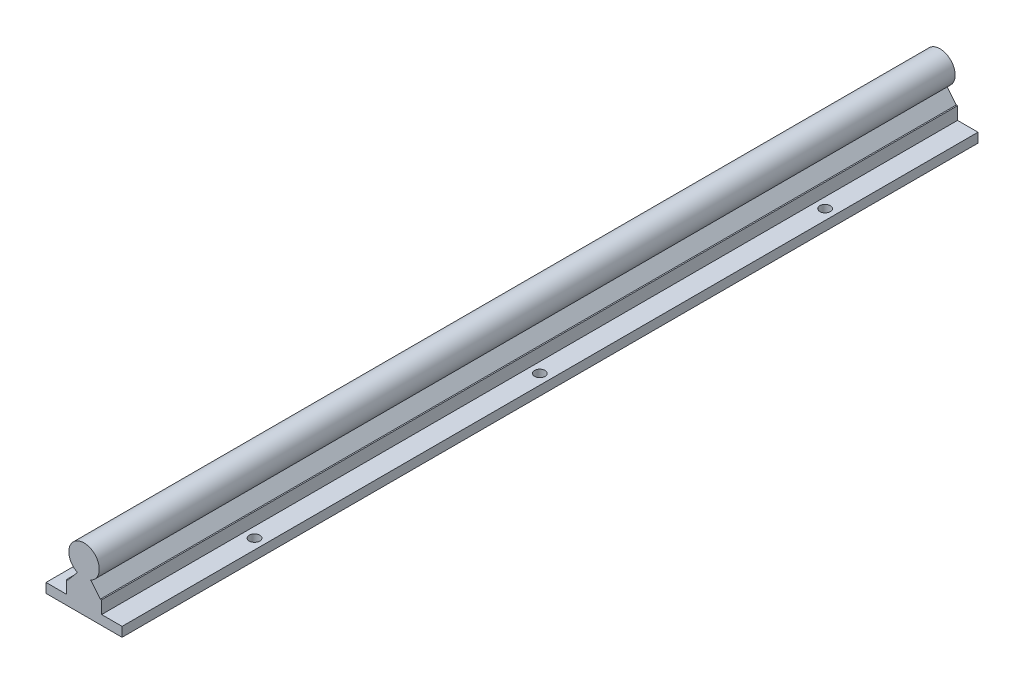
ISO-10303-21;
HEADER;
FILE_DESCRIPTION(('STEP AP214'),'2;1');
FILE_NAME('part.step','',(''),(''),'','','');
FILE_SCHEMA(('AUTOMOTIVE_DESIGN { 1 0 10303 214 1 1 1 1 }'));
ENDSEC;
DATA;
#1=APPLICATION_CONTEXT('core data for automotive mechanical design processes');
#2=APPLICATION_PROTOCOL_DEFINITION('international standard','automotive_design',2000,#1);
#3=PRODUCT_CONTEXT('',#1,'mechanical');
#4=PRODUCT('Part','Part','',(#3));
#5=PRODUCT_RELATED_PRODUCT_CATEGORY('part','',(#4));
#6=PRODUCT_DEFINITION_FORMATION('','',#4);
#7=PRODUCT_DEFINITION_CONTEXT('part definition',#1,'design');
#8=PRODUCT_DEFINITION('design','',#6,#7);
#9=PRODUCT_DEFINITION_SHAPE('','',#8);
#10=(LENGTH_UNIT() NAMED_UNIT(*) SI_UNIT(.MILLI.,.METRE.));
#11=(NAMED_UNIT(*) PLANE_ANGLE_UNIT() SI_UNIT($,.RADIAN.));
#12=(NAMED_UNIT(*) SI_UNIT($,.STERADIAN.) SOLID_ANGLE_UNIT());
#13=UNCERTAINTY_MEASURE_WITH_UNIT(LENGTH_MEASURE(1.E-05),#10,'distance_accuracy_value','');
#14=(GEOMETRIC_REPRESENTATION_CONTEXT(3) GLOBAL_UNCERTAINTY_ASSIGNED_CONTEXT((#13)) GLOBAL_UNIT_ASSIGNED_CONTEXT((#10,
#11,#12)) REPRESENTATION_CONTEXT('',''));
#15=CARTESIAN_POINT('',(0.,0.,0.));
#16=DIRECTION('',(0.,0.,1.));
#17=DIRECTION('',(1.,0.,0.));
#18=AXIS2_PLACEMENT_3D('',#15,#16,#17);
#19=CARTESIAN_POINT('',(-20.,0.,450.));
#20=DIRECTION('',(1.,0.,0.));
#21=DIRECTION('',(0.,0.,-1.));
#22=AXIS2_PLACEMENT_3D('',#19,#20,#21);
#23=PLANE('',#22);
#24=DIRECTION('',(0.,-1.,0.));
#25=VECTOR('',#24,1.);
#26=CARTESIAN_POINT('',(-20.,0.,0.));
#27=LINE('',#26,#25);
#28=CARTESIAN_POINT('',(-20.,5.,0.));
#29=VERTEX_POINT('',#28);
#30=CARTESIAN_POINT('',(-20.,0.,0.));
#31=VERTEX_POINT('',#30);
#32=EDGE_CURVE('E154',#29,#31,#27,.T.);
#33=ORIENTED_EDGE('',*,*,#32,.T.);
#34=DIRECTION('',(0.,0.,-1.));
#35=VECTOR('',#34,1.);
#36=CARTESIAN_POINT('',(-20.,0.,450.));
#37=LINE('',#36,#35);
#38=CARTESIAN_POINT('',(-20.,0.,450.));
#39=VERTEX_POINT('',#38);
#40=EDGE_CURVE('E11',#39,#31,#37,.T.);
#41=ORIENTED_EDGE('',*,*,#40,.F.);
#42=DIRECTION('',(0.,-1.,0.));
#43=VECTOR('',#42,1.);
#44=CARTESIAN_POINT('',(-20.,0.,450.));
#45=LINE('',#44,#43);
#46=CARTESIAN_POINT('',(-20.,5.,450.));
#47=VERTEX_POINT('',#46);
#48=EDGE_CURVE('E177',#47,#39,#45,.T.);
#49=ORIENTED_EDGE('',*,*,#48,.F.);
#50=DIRECTION('',(0.,0.,-1.));
#51=VECTOR('',#50,1.);
#52=CARTESIAN_POINT('',(-20.,5.,450.));
#53=LINE('',#52,#51);
#54=EDGE_CURVE('E150',#47,#29,#53,.T.);
#55=ORIENTED_EDGE('',*,*,#54,.T.);
#56=EDGE_LOOP('',(#33,#41,#49,#55));
#57=FACE_BOUND('',#56,.T.);
#58=ADVANCED_FACE('F32',(#57),#23,.F.);
#59=CARTESIAN_POINT('',(20.,0.,450.));
#60=DIRECTION('',(0.,1.,0.));
#61=DIRECTION('',(0.,0.,1.));
#62=AXIS2_PLACEMENT_3D('',#59,#60,#61);
#63=PLANE('',#62);
#64=CARTESIAN_POINT('',(14.6250000000031,0.,375.));
#65=DIRECTION('',(0.,1.,0.));
#66=DIRECTION('',(0.,0.,-1.));
#67=AXIS2_PLACEMENT_3D('',#64,#65,#66);
#68=CIRCLE('',#67,2.75);
#69=CARTESIAN_POINT('',(14.6250000000031,0.,372.25));
#70=VERTEX_POINT('',#69);
#71=EDGE_CURVE('E227',#70,#70,#68,.T.);
#72=ORIENTED_EDGE('',*,*,#71,.T.);
#73=EDGE_LOOP('',(#72));
#74=FACE_BOUND('',#73,.T.);
#75=CARTESIAN_POINT('',(-14.6249999999969,0.,375.));
#76=DIRECTION('',(0.,1.,0.));
#77=DIRECTION('',(0.,0.,1.));
#78=AXIS2_PLACEMENT_3D('',#75,#76,#77);
#79=CIRCLE('',#78,2.75);
#80=CARTESIAN_POINT('',(-14.6249999999969,0.,377.75));
#81=VERTEX_POINT('',#80);
#82=EDGE_CURVE('E217',#81,#81,#79,.T.);
#83=ORIENTED_EDGE('',*,*,#82,.T.);
#84=EDGE_LOOP('',(#83));
#85=FACE_BOUND('',#84,.T.);
#86=CARTESIAN_POINT('',(14.6250000000016,0.,225.));
#87=DIRECTION('',(0.,1.,0.));
#88=DIRECTION('',(0.,0.,-1.));
#89=AXIS2_PLACEMENT_3D('',#86,#87,#88);
#90=CIRCLE('',#89,2.75);
#91=CARTESIAN_POINT('',(14.6250000000016,0.,222.25));
#92=VERTEX_POINT('',#91);
#93=EDGE_CURVE('E214',#92,#92,#90,.T.);
#94=ORIENTED_EDGE('',*,*,#93,.T.);
#95=EDGE_LOOP('',(#94));
#96=FACE_BOUND('',#95,.T.);
#97=CARTESIAN_POINT('',(-14.6249999999984,0.,225.));
#98=DIRECTION('',(0.,1.,0.));
#99=DIRECTION('',(0.,0.,1.));
#100=AXIS2_PLACEMENT_3D('',#97,#98,#99);
#101=CIRCLE('',#100,2.75);
#102=CARTESIAN_POINT('',(-14.6249999999984,0.,227.75));
#103=VERTEX_POINT('',#102);
#104=EDGE_CURVE('E211',#103,#103,#101,.T.);
#105=ORIENTED_EDGE('',*,*,#104,.T.);
#106=EDGE_LOOP('',(#105));
#107=FACE_BOUND('',#106,.T.);
#108=CARTESIAN_POINT('',(14.625,0.,74.9999999999999));
#109=DIRECTION('',(0.,1.,0.));
#110=DIRECTION('',(0.,0.,-1.));
#111=AXIS2_PLACEMENT_3D('',#108,#109,#110);
#112=CIRCLE('',#111,2.75);
#113=CARTESIAN_POINT('',(14.625,0.,72.2499999999999));
#114=VERTEX_POINT('',#113);
#115=EDGE_CURVE('E207',#114,#114,#112,.T.);
#116=ORIENTED_EDGE('',*,*,#115,.T.);
#117=EDGE_LOOP('',(#116));
#118=FACE_BOUND('',#117,.T.);
#119=CARTESIAN_POINT('',(-14.625,0.,75.));
#120=DIRECTION('',(0.,1.,0.));
#121=DIRECTION('',(0.,0.,1.));
#122=AXIS2_PLACEMENT_3D('',#119,#120,#121);
#123=CIRCLE('',#122,2.75);
#124=CARTESIAN_POINT('',(-14.625,0.,77.75));
#125=VERTEX_POINT('',#124);
#126=EDGE_CURVE('E203',#125,#125,#123,.T.);
#127=ORIENTED_EDGE('',*,*,#126,.T.);
#128=EDGE_LOOP('',(#127));
#129=FACE_BOUND('',#128,.T.);
#130=DIRECTION('',(1.,0.,0.));
#131=VECTOR('',#130,1.);
#132=CARTESIAN_POINT('',(20.,0.,0.));
#133=LINE('',#132,#131);
#134=CARTESIAN_POINT('',(20.,0.,0.));
#135=VERTEX_POINT('',#134);
#136=EDGE_CURVE('E157',#31,#135,#133,.T.);
#137=ORIENTED_EDGE('',*,*,#136,.T.);
#138=DIRECTION('',(0.,0.,-1.));
#139=VECTOR('',#138,1.);
#140=CARTESIAN_POINT('',(20.,0.,450.));
#141=LINE('',#140,#139);
#142=CARTESIAN_POINT('',(20.,0.,450.));
#143=VERTEX_POINT('',#142);
#144=EDGE_CURVE('E41',#143,#135,#141,.T.);
#145=ORIENTED_EDGE('',*,*,#144,.F.);
#146=DIRECTION('',(1.,0.,0.));
#147=VECTOR('',#146,1.);
#148=CARTESIAN_POINT('',(20.,0.,450.));
#149=LINE('',#148,#147);
#150=EDGE_CURVE('E105',#39,#143,#149,.T.);
#151=ORIENTED_EDGE('',*,*,#150,.F.);
#152=ORIENTED_EDGE('',*,*,#40,.T.);
#153=EDGE_LOOP('',(#137,#145,#151,#152));
#154=FACE_BOUND('',#153,.T.);
#155=ADVANCED_FACE('F279',(#74,#85,#96,#107,#118,#129,#154),#63,.F.);
#156=CARTESIAN_POINT('',(20.,0.,450.));
#157=DIRECTION('',(-1.,0.,0.));
#158=DIRECTION('',(0.,0.,1.));
#159=AXIS2_PLACEMENT_3D('',#156,#157,#158);
#160=PLANE('',#159);
#161=DIRECTION('',(0.,1.,0.));
#162=VECTOR('',#161,1.);
#163=CARTESIAN_POINT('',(20.,0.,0.));
#164=LINE('',#163,#162);
#165=CARTESIAN_POINT('',(20.,5.,0.));
#166=VERTEX_POINT('',#165);
#167=EDGE_CURVE('E160',#135,#166,#164,.T.);
#168=ORIENTED_EDGE('',*,*,#167,.T.);
#169=DIRECTION('',(0.,0.,-1.));
#170=VECTOR('',#169,1.);
#171=CARTESIAN_POINT('',(20.,5.,450.));
#172=LINE('',#171,#170);
#173=CARTESIAN_POINT('',(20.,5.,450.));
#174=VERTEX_POINT('',#173);
#175=EDGE_CURVE('E196',#174,#166,#172,.T.);
#176=ORIENTED_EDGE('',*,*,#175,.F.);
#177=DIRECTION('',(0.,1.,0.));
#178=VECTOR('',#177,1.);
#179=CARTESIAN_POINT('',(20.,0.,450.));
#180=LINE('',#179,#178);
#181=EDGE_CURVE('E238',#143,#174,#180,.T.);
#182=ORIENTED_EDGE('',*,*,#181,.F.);
#183=ORIENTED_EDGE('',*,*,#144,.T.);
#184=EDGE_LOOP('',(#168,#176,#182,#183));
#185=FACE_BOUND('',#184,.T.);
#186=ADVANCED_FACE('F283',(#185),#160,.F.);
#187=CARTESIAN_POINT('',(20.,5.,450.));
#188=DIRECTION('',(0.,-1.,0.));
#189=DIRECTION('',(1.,0.,0.));
#190=AXIS2_PLACEMENT_3D('',#187,#188,#189);
#191=PLANE('',#190);
#192=CARTESIAN_POINT('',(14.6250000000031,5.,375.));
#193=DIRECTION('',(0.,-1.,0.));
#194=DIRECTION('',(1.,0.,0.));
#195=AXIS2_PLACEMENT_3D('',#192,#193,#194);
#196=CIRCLE('',#195,2.75);
#197=CARTESIAN_POINT('',(17.3750000000031,5.,375.));
#198=VERTEX_POINT('',#197);
#199=EDGE_CURVE('E35',#198,#198,#196,.F.);
#200=ORIENTED_EDGE('',*,*,#199,.F.);
#201=EDGE_LOOP('',(#200));
#202=FACE_BOUND('',#201,.T.);
#203=CARTESIAN_POINT('',(14.6250000000016,5.,225.));
#204=DIRECTION('',(0.,-1.,0.));
#205=DIRECTION('',(1.,0.,0.));
#206=AXIS2_PLACEMENT_3D('',#203,#204,#205);
#207=CIRCLE('',#206,2.75);
#208=CARTESIAN_POINT('',(17.3750000000016,5.,225.));
#209=VERTEX_POINT('',#208);
#210=EDGE_CURVE('E212',#209,#209,#207,.F.);
#211=ORIENTED_EDGE('',*,*,#210,.F.);
#212=EDGE_LOOP('',(#211));
#213=FACE_BOUND('',#212,.T.);
#214=CARTESIAN_POINT('',(14.625,5.,74.9999999999999));
#215=DIRECTION('',(0.,-1.,0.));
#216=DIRECTION('',(1.,0.,0.));
#217=AXIS2_PLACEMENT_3D('',#214,#215,#216);
#218=CIRCLE('',#217,2.75);
#219=CARTESIAN_POINT('',(17.375,5.,74.9999999999999));
#220=VERTEX_POINT('',#219);
#221=EDGE_CURVE('E204',#220,#220,#218,.F.);
#222=ORIENTED_EDGE('',*,*,#221,.F.);
#223=EDGE_LOOP('',(#222));
#224=FACE_BOUND('',#223,.T.);
#225=DIRECTION('',(-1.,0.,0.));
#226=VECTOR('',#225,1.);
#227=CARTESIAN_POINT('',(20.,5.,0.));
#228=LINE('',#227,#226);
#229=CARTESIAN_POINT('',(9.25,5.,0.));
#230=VERTEX_POINT('',#229);
#231=EDGE_CURVE('E162',#166,#230,#228,.T.);
#232=ORIENTED_EDGE('',*,*,#231,.T.);
#233=DIRECTION('',(0.,0.,-1.));
#234=VECTOR('',#233,1.);
#235=CARTESIAN_POINT('',(9.25,5.,450.));
#236=LINE('',#235,#234);
#237=CARTESIAN_POINT('',(9.25,5.,450.));
#238=VERTEX_POINT('',#237);
#239=EDGE_CURVE('E193',#238,#230,#236,.T.);
#240=ORIENTED_EDGE('',*,*,#239,.F.);
#241=DIRECTION('',(-1.,0.,0.));
#242=VECTOR('',#241,1.);
#243=CARTESIAN_POINT('',(20.,5.,450.));
#244=LINE('',#243,#242);
#245=EDGE_CURVE('E240',#174,#238,#244,.T.);
#246=ORIENTED_EDGE('',*,*,#245,.F.);
#247=ORIENTED_EDGE('',*,*,#175,.T.);
#248=EDGE_LOOP('',(#232,#240,#246,#247));
#249=FACE_BOUND('',#248,.T.);
#250=ADVANCED_FACE('F288',(#202,#213,#224,#249),#191,.F.);
#251=CARTESIAN_POINT('',(9.25,5.,450.));
#252=DIRECTION('',(-1.,0.,0.));
#253=DIRECTION('',(0.,0.,1.));
#254=AXIS2_PLACEMENT_3D('',#251,#252,#253);
#255=PLANE('',#254);
#256=DIRECTION('',(0.,1.,0.));
#257=VECTOR('',#256,1.);
#258=CARTESIAN_POINT('',(9.25,5.,0.));
#259=LINE('',#258,#257);
#260=CARTESIAN_POINT('',(9.25,11.7,0.));
#261=VERTEX_POINT('',#260);
#262=EDGE_CURVE('E164',#230,#261,#259,.T.);
#263=ORIENTED_EDGE('',*,*,#262,.T.);
#264=DIRECTION('',(0.,0.,-1.));
#265=VECTOR('',#264,1.);
#266=CARTESIAN_POINT('',(9.25,11.7,450.));
#267=LINE('',#266,#265);
#268=CARTESIAN_POINT('',(9.25,11.7,450.));
#269=VERTEX_POINT('',#268);
#270=EDGE_CURVE('E190',#269,#261,#267,.T.);
#271=ORIENTED_EDGE('',*,*,#270,.F.);
#272=DIRECTION('',(0.,1.,0.));
#273=VECTOR('',#272,1.);
#274=CARTESIAN_POINT('',(9.25,5.,450.));
#275=LINE('',#274,#273);
#276=EDGE_CURVE('E242',#238,#269,#275,.T.);
#277=ORIENTED_EDGE('',*,*,#276,.F.);
#278=ORIENTED_EDGE('',*,*,#239,.T.);
#279=EDGE_LOOP('',(#263,#271,#277,#278));
#280=FACE_BOUND('',#279,.T.);
#281=ADVANCED_FACE('F295',(#280),#255,.F.);
#282=CARTESIAN_POINT('',(9.25,11.7,450.));
#283=DIRECTION('',(0.,-1.,0.));
#284=DIRECTION('',(0.,0.,-1.));
#285=AXIS2_PLACEMENT_3D('',#282,#283,#284);
#286=PLANE('',#285);
#287=DIRECTION('',(-1.,0.,0.));
#288=VECTOR('',#287,1.);
#289=CARTESIAN_POINT('',(9.25,11.7,0.));
#290=LINE('',#289,#288);
#291=CARTESIAN_POINT('',(8.60562690501395,11.7,0.));
#292=VERTEX_POINT('',#291);
#293=EDGE_CURVE('E166',#261,#292,#290,.T.);
#294=ORIENTED_EDGE('',*,*,#293,.T.);
#295=DIRECTION('',(0.,0.,-1.));
#296=VECTOR('',#295,1.);
#297=CARTESIAN_POINT('',(8.60562690501395,11.7,450.));
#298=LINE('',#297,#296);
#299=CARTESIAN_POINT('',(8.60562690501395,11.7,450.));
#300=VERTEX_POINT('',#299);
#301=EDGE_CURVE('E187',#300,#292,#298,.T.);
#302=ORIENTED_EDGE('',*,*,#301,.F.);
#303=DIRECTION('',(-1.,0.,0.));
#304=VECTOR('',#303,1.);
#305=CARTESIAN_POINT('',(9.25,11.7,450.));
#306=LINE('',#305,#304);
#307=EDGE_CURVE('E244',#269,#300,#306,.T.);
#308=ORIENTED_EDGE('',*,*,#307,.F.);
#309=ORIENTED_EDGE('',*,*,#270,.T.);
#310=EDGE_LOOP('',(#294,#302,#308,#309));
#311=FACE_BOUND('',#310,.T.);
#312=ADVANCED_FACE('F299',(#311),#286,.F.);
#313=CARTESIAN_POINT('',(8.60562690501395,11.7,450.));
#314=DIRECTION('',(-0.766044443118978,-0.64278760968654,0.));
#315=DIRECTION('',(0.64278760968654,-0.766044443118978,0.));
#316=AXIS2_PLACEMENT_3D('',#313,#314,#315);
#317=PLANE('',#316);
#318=DIRECTION('',(-0.64278760968654,0.766044443118978,0.));
#319=VECTOR('',#318,1.);
#320=CARTESIAN_POINT('',(8.60562690501395,11.7,0.));
#321=LINE('',#320,#319);
#322=CARTESIAN_POINT('',(3.48711915483253,17.8,0.));
#323=VERTEX_POINT('',#322);
#324=EDGE_CURVE('E168',#292,#323,#321,.T.);
#325=ORIENTED_EDGE('',*,*,#324,.T.);
#326=DIRECTION('',(0.,0.,-1.));
#327=VECTOR('',#326,1.);
#328=CARTESIAN_POINT('',(3.48711915483253,17.8,450.));
#329=LINE('',#328,#327);
#330=CARTESIAN_POINT('',(3.48711915483253,17.8,450.));
#331=VERTEX_POINT('',#330);
#332=EDGE_CURVE('E184',#331,#323,#329,.T.);
#333=ORIENTED_EDGE('',*,*,#332,.F.);
#334=DIRECTION('',(-0.64278760968654,0.766044443118978,0.));
#335=VECTOR('',#334,1.);
#336=CARTESIAN_POINT('',(8.60562690501395,11.7,450.));
#337=LINE('',#336,#335);
#338=EDGE_CURVE('E246',#300,#331,#337,.T.);
#339=ORIENTED_EDGE('',*,*,#338,.F.);
#340=ORIENTED_EDGE('',*,*,#301,.T.);
#341=EDGE_LOOP('',(#325,#333,#339,#340));
#342=FACE_BOUND('',#341,.T.);
#343=ADVANCED_FACE('F303',(#342),#317,.F.);
#344=CARTESIAN_POINT('',(0.,25.,450.));
#345=DIRECTION('',(0.,0.,-1.));
#346=DIRECTION('',(-1.,0.,0.));
#347=AXIS2_PLACEMENT_3D('',#344,#345,#346);
#348=CYLINDRICAL_SURFACE('',#347,8.);
#349=CARTESIAN_POINT('',(0.,25.,0.));
#350=DIRECTION('',(0.,0.,1.));
#351=DIRECTION('',(1.,0.,0.));
#352=AXIS2_PLACEMENT_3D('',#349,#350,#351);
#353=CIRCLE('',#352,8.);
#354=CARTESIAN_POINT('',(-3.48711915483254,17.8,0.));
#355=VERTEX_POINT('',#354);
#356=EDGE_CURVE('E170',#323,#355,#353,.T.);
#357=ORIENTED_EDGE('',*,*,#356,.T.);
#358=DIRECTION('',(0.,0.,-1.));
#359=VECTOR('',#358,1.);
#360=CARTESIAN_POINT('',(-3.48711915483254,17.8,450.));
#361=LINE('',#360,#359);
#362=CARTESIAN_POINT('',(-3.48711915483254,17.8,450.));
#363=VERTEX_POINT('',#362);
#364=EDGE_CURVE('E181',#363,#355,#361,.T.);
#365=ORIENTED_EDGE('',*,*,#364,.F.);
#366=CARTESIAN_POINT('',(0.,25.,450.));
#367=DIRECTION('',(0.,0.,1.));
#368=DIRECTION('',(1.,0.,0.));
#369=AXIS2_PLACEMENT_3D('',#366,#367,#368);
#370=CIRCLE('',#369,8.);
#371=EDGE_CURVE('E248',#331,#363,#370,.T.);
#372=ORIENTED_EDGE('',*,*,#371,.F.);
#373=ORIENTED_EDGE('',*,*,#332,.T.);
#374=EDGE_LOOP('',(#357,#365,#372,#373));
#375=FACE_BOUND('',#374,.T.);
#376=ADVANCED_FACE('F254',(#375),#348,.T.);
#377=CARTESIAN_POINT('',(-8.60562690501395,11.7,450.));
#378=DIRECTION('',(0.766044443118978,-0.642787609686539,0.));
#379=DIRECTION('',(0.642787609686539,0.766044443118978,0.));
#380=AXIS2_PLACEMENT_3D('',#377,#378,#379);
#381=PLANE('',#380);
#382=DIRECTION('',(-0.642787609686539,-0.766044443118978,0.));
#383=VECTOR('',#382,1.);
#384=CARTESIAN_POINT('',(-8.60562690501395,11.7,0.));
#385=LINE('',#384,#383);
#386=CARTESIAN_POINT('',(-8.60562690501395,11.7,0.));
#387=VERTEX_POINT('',#386);
#388=EDGE_CURVE('E172',#355,#387,#385,.T.);
#389=ORIENTED_EDGE('',*,*,#388,.T.);
#390=DIRECTION('',(0.,0.,-1.));
#391=VECTOR('',#390,1.);
#392=CARTESIAN_POINT('',(-8.60562690501395,11.7,450.));
#393=LINE('',#392,#391);
#394=CARTESIAN_POINT('',(-8.60562690501395,11.7,450.));
#395=VERTEX_POINT('',#394);
#396=EDGE_CURVE('E145',#395,#387,#393,.T.);
#397=ORIENTED_EDGE('',*,*,#396,.F.);
#398=DIRECTION('',(-0.642787609686539,-0.766044443118978,0.));
#399=VECTOR('',#398,1.);
#400=CARTESIAN_POINT('',(-8.60562690501395,11.7,450.));
#401=LINE('',#400,#399);
#402=EDGE_CURVE('E136',#363,#395,#401,.T.);
#403=ORIENTED_EDGE('',*,*,#402,.F.);
#404=ORIENTED_EDGE('',*,*,#364,.T.);
#405=EDGE_LOOP('',(#389,#397,#403,#404));
#406=FACE_BOUND('',#405,.T.);
#407=ADVANCED_FACE('F258',(#406),#381,.F.);
#408=CARTESIAN_POINT('',(-9.25,11.7,450.));
#409=DIRECTION('',(0.,-1.,0.));
#410=DIRECTION('',(1.,0.,0.));
#411=AXIS2_PLACEMENT_3D('',#408,#409,#410);
#412=PLANE('',#411);
#413=DIRECTION('',(-1.,0.,0.));
#414=VECTOR('',#413,1.);
#415=CARTESIAN_POINT('',(-9.25,11.7,0.));
#416=LINE('',#415,#414);
#417=CARTESIAN_POINT('',(-9.25,11.7,0.));
#418=VERTEX_POINT('',#417);
#419=EDGE_CURVE('E144',#387,#418,#416,.T.);
#420=ORIENTED_EDGE('',*,*,#419,.T.);
#421=DIRECTION('',(0.,0.,-1.));
#422=VECTOR('',#421,1.);
#423=CARTESIAN_POINT('',(-9.25,11.7,450.));
#424=LINE('',#423,#422);
#425=CARTESIAN_POINT('',(-9.25,11.7,450.));
#426=VERTEX_POINT('',#425);
#427=EDGE_CURVE('E141',#426,#418,#424,.T.);
#428=ORIENTED_EDGE('',*,*,#427,.F.);
#429=DIRECTION('',(-1.,0.,0.));
#430=VECTOR('',#429,1.);
#431=CARTESIAN_POINT('',(-9.25,11.7,450.));
#432=LINE('',#431,#430);
#433=EDGE_CURVE('E130',#395,#426,#432,.T.);
#434=ORIENTED_EDGE('',*,*,#433,.F.);
#435=ORIENTED_EDGE('',*,*,#396,.T.);
#436=EDGE_LOOP('',(#420,#428,#434,#435));
#437=FACE_BOUND('',#436,.T.);
#438=ADVANCED_FACE('F142',(#437),#412,.F.);
#439=CARTESIAN_POINT('',(-9.25,5.,450.));
#440=DIRECTION('',(1.,0.,0.));
#441=DIRECTION('',(0.,0.,-1.));
#442=AXIS2_PLACEMENT_3D('',#439,#440,#441);
#443=PLANE('',#442);
#444=DIRECTION('',(0.,-1.,0.));
#445=VECTOR('',#444,1.);
#446=CARTESIAN_POINT('',(-9.25,5.,0.));
#447=LINE('',#446,#445);
#448=CARTESIAN_POINT('',(-9.25,5.,0.));
#449=VERTEX_POINT('',#448);
#450=EDGE_CURVE('E91',#418,#449,#447,.T.);
#451=ORIENTED_EDGE('',*,*,#450,.T.);
#452=DIRECTION('',(0.,0.,-1.));
#453=VECTOR('',#452,1.);
#454=CARTESIAN_POINT('',(-9.25,5.,450.));
#455=LINE('',#454,#453);
#456=CARTESIAN_POINT('',(-9.25,5.,450.));
#457=VERTEX_POINT('',#456);
#458=EDGE_CURVE('E146',#457,#449,#455,.T.);
#459=ORIENTED_EDGE('',*,*,#458,.F.);
#460=DIRECTION('',(0.,-1.,0.));
#461=VECTOR('',#460,1.);
#462=CARTESIAN_POINT('',(-9.25,5.,450.));
#463=LINE('',#462,#461);
#464=EDGE_CURVE('E134',#426,#457,#463,.T.);
#465=ORIENTED_EDGE('',*,*,#464,.F.);
#466=ORIENTED_EDGE('',*,*,#427,.T.);
#467=EDGE_LOOP('',(#451,#459,#465,#466));
#468=FACE_BOUND('',#467,.T.);
#469=ADVANCED_FACE('F148',(#468),#443,.F.);
#470=CARTESIAN_POINT('',(-20.,5.,450.));
#471=DIRECTION('',(0.,-1.,0.));
#472=DIRECTION('',(1.,0.,0.));
#473=AXIS2_PLACEMENT_3D('',#470,#471,#472);
#474=PLANE('',#473);
#475=CARTESIAN_POINT('',(-14.6249999999969,5.,375.));
#476=DIRECTION('',(0.,-1.,0.));
#477=DIRECTION('',(1.,0.,0.));
#478=AXIS2_PLACEMENT_3D('',#475,#476,#477);
#479=CIRCLE('',#478,2.75);
#480=CARTESIAN_POINT('',(-11.8749999999969,5.,375.));
#481=VERTEX_POINT('',#480);
#482=EDGE_CURVE('E215',#481,#481,#479,.F.);
#483=ORIENTED_EDGE('',*,*,#482,.F.);
#484=EDGE_LOOP('',(#483));
#485=FACE_BOUND('',#484,.T.);
#486=CARTESIAN_POINT('',(-14.6249999999984,5.,225.));
#487=DIRECTION('',(0.,-1.,0.));
#488=DIRECTION('',(1.,0.,0.));
#489=AXIS2_PLACEMENT_3D('',#486,#487,#488);
#490=CIRCLE('',#489,2.75);
#491=CARTESIAN_POINT('',(-11.8749999999984,5.,225.));
#492=VERTEX_POINT('',#491);
#493=EDGE_CURVE('E208',#492,#492,#490,.F.);
#494=ORIENTED_EDGE('',*,*,#493,.F.);
#495=EDGE_LOOP('',(#494));
#496=FACE_BOUND('',#495,.T.);
#497=CARTESIAN_POINT('',(-14.625,5.,75.));
#498=DIRECTION('',(0.,-1.,0.));
#499=DIRECTION('',(1.,0.,0.));
#500=AXIS2_PLACEMENT_3D('',#497,#498,#499);
#501=CIRCLE('',#500,2.75);
#502=CARTESIAN_POINT('',(-11.875,5.,75.));
#503=VERTEX_POINT('',#502);
#504=EDGE_CURVE('E158',#503,#503,#501,.F.);
#505=ORIENTED_EDGE('',*,*,#504,.F.);
#506=EDGE_LOOP('',(#505));
#507=FACE_BOUND('',#506,.T.);
#508=DIRECTION('',(-1.,0.,0.));
#509=VECTOR('',#508,1.);
#510=CARTESIAN_POINT('',(-20.,5.,0.));
#511=LINE('',#510,#509);
#512=EDGE_CURVE('E97',#449,#29,#511,.T.);
#513=ORIENTED_EDGE('',*,*,#512,.T.);
#514=ORIENTED_EDGE('',*,*,#54,.F.);
#515=DIRECTION('',(-1.,0.,0.));
#516=VECTOR('',#515,1.);
#517=CARTESIAN_POINT('',(-20.,5.,450.));
#518=LINE('',#517,#516);
#519=EDGE_CURVE('E50',#457,#47,#518,.T.);
#520=ORIENTED_EDGE('',*,*,#519,.F.);
#521=ORIENTED_EDGE('',*,*,#458,.T.);
#522=EDGE_LOOP('',(#513,#514,#520,#521));
#523=FACE_BOUND('',#522,.T.);
#524=ADVANCED_FACE('F266',(#485,#496,#507,#523),#474,.F.);
#525=CARTESIAN_POINT('',(0.,25.,450.));
#526=DIRECTION('',(0.,0.,1.));
#527=DIRECTION('',(1.,0.,0.));
#528=AXIS2_PLACEMENT_3D('',#525,#526,#527);
#529=PLANE('',#528);
#530=ORIENTED_EDGE('',*,*,#48,.T.);
#531=ORIENTED_EDGE('',*,*,#150,.T.);
#532=ORIENTED_EDGE('',*,*,#181,.T.);
#533=ORIENTED_EDGE('',*,*,#245,.T.);
#534=ORIENTED_EDGE('',*,*,#276,.T.);
#535=ORIENTED_EDGE('',*,*,#307,.T.);
#536=ORIENTED_EDGE('',*,*,#338,.T.);
#537=ORIENTED_EDGE('',*,*,#371,.T.);
#538=ORIENTED_EDGE('',*,*,#402,.T.);
#539=ORIENTED_EDGE('',*,*,#433,.T.);
#540=ORIENTED_EDGE('',*,*,#464,.T.);
#541=ORIENTED_EDGE('',*,*,#519,.T.);
#542=EDGE_LOOP('',(#530,#531,#532,#533,#534,#535,#536,#537,#538,#539,#540,#541));
#543=FACE_BOUND('',#542,.T.);
#544=ADVANCED_FACE('F132',(#543),#529,.T.);
#545=CARTESIAN_POINT('',(0.,25.,0.));
#546=DIRECTION('',(0.,0.,1.));
#547=DIRECTION('',(1.,0.,0.));
#548=AXIS2_PLACEMENT_3D('',#545,#546,#547);
#549=PLANE('',#548);
#550=ORIENTED_EDGE('',*,*,#32,.F.);
#551=ORIENTED_EDGE('',*,*,#512,.F.);
#552=ORIENTED_EDGE('',*,*,#450,.F.);
#553=ORIENTED_EDGE('',*,*,#419,.F.);
#554=ORIENTED_EDGE('',*,*,#388,.F.);
#555=ORIENTED_EDGE('',*,*,#356,.F.);
#556=ORIENTED_EDGE('',*,*,#324,.F.);
#557=ORIENTED_EDGE('',*,*,#293,.F.);
#558=ORIENTED_EDGE('',*,*,#262,.F.);
#559=ORIENTED_EDGE('',*,*,#231,.F.);
#560=ORIENTED_EDGE('',*,*,#167,.F.);
#561=ORIENTED_EDGE('',*,*,#136,.F.);
#562=EDGE_LOOP('',(#550,#551,#552,#553,#554,#555,#556,#557,#558,#559,#560,#561));
#563=FACE_BOUND('',#562,.T.);
#564=ADVANCED_FACE('F261',(#563),#549,.F.);
#565=CARTESIAN_POINT('',(-14.625,450.,75.));
#566=DIRECTION('',(0.,-1.,0.));
#567=DIRECTION('',(0.,0.,-1.));
#568=AXIS2_PLACEMENT_3D('',#565,#566,#567);
#569=CYLINDRICAL_SURFACE('',#568,2.75);
#570=ORIENTED_EDGE('',*,*,#126,.F.);
#571=EDGE_LOOP('',(#570));
#572=FACE_BOUND('',#571,.T.);
#573=ORIENTED_EDGE('',*,*,#504,.T.);
#574=EDGE_LOOP('',(#573));
#575=FACE_BOUND('',#574,.T.);
#576=ADVANCED_FACE('F336',(#572,#575),#569,.F.);
#577=CARTESIAN_POINT('',(14.625,450.,74.9999999999999));
#578=DIRECTION('',(0.,-1.,0.));
#579=DIRECTION('',(0.,0.,-1.));
#580=AXIS2_PLACEMENT_3D('',#577,#578,#579);
#581=CYLINDRICAL_SURFACE('',#580,2.75);
#582=ORIENTED_EDGE('',*,*,#115,.F.);
#583=EDGE_LOOP('',(#582));
#584=FACE_BOUND('',#583,.T.);
#585=ORIENTED_EDGE('',*,*,#221,.T.);
#586=EDGE_LOOP('',(#585));
#587=FACE_BOUND('',#586,.T.);
#588=ADVANCED_FACE('F361',(#584,#587),#581,.F.);
#589=CARTESIAN_POINT('',(-14.6249999999984,450.,225.));
#590=DIRECTION('',(0.,-1.,0.));
#591=DIRECTION('',(0.,0.,-1.));
#592=AXIS2_PLACEMENT_3D('',#589,#590,#591);
#593=CYLINDRICAL_SURFACE('',#592,2.75);
#594=ORIENTED_EDGE('',*,*,#104,.F.);
#595=EDGE_LOOP('',(#594));
#596=FACE_BOUND('',#595,.T.);
#597=ORIENTED_EDGE('',*,*,#493,.T.);
#598=EDGE_LOOP('',(#597));
#599=FACE_BOUND('',#598,.T.);
#600=ADVANCED_FACE('F371',(#596,#599),#593,.F.);
#601=CARTESIAN_POINT('',(14.6250000000016,450.,225.));
#602=DIRECTION('',(0.,-1.,0.));
#603=DIRECTION('',(0.,0.,-1.));
#604=AXIS2_PLACEMENT_3D('',#601,#602,#603);
#605=CYLINDRICAL_SURFACE('',#604,2.75);
#606=ORIENTED_EDGE('',*,*,#93,.F.);
#607=EDGE_LOOP('',(#606));
#608=FACE_BOUND('',#607,.T.);
#609=ORIENTED_EDGE('',*,*,#210,.T.);
#610=EDGE_LOOP('',(#609));
#611=FACE_BOUND('',#610,.T.);
#612=ADVANCED_FACE('F381',(#608,#611),#605,.F.);
#613=CARTESIAN_POINT('',(-14.6249999999969,450.,375.));
#614=DIRECTION('',(0.,-1.,0.));
#615=DIRECTION('',(0.,0.,-1.));
#616=AXIS2_PLACEMENT_3D('',#613,#614,#615);
#617=CYLINDRICAL_SURFACE('',#616,2.75);
#618=ORIENTED_EDGE('',*,*,#82,.F.);
#619=EDGE_LOOP('',(#618));
#620=FACE_BOUND('',#619,.T.);
#621=ORIENTED_EDGE('',*,*,#482,.T.);
#622=EDGE_LOOP('',(#621));
#623=FACE_BOUND('',#622,.T.);
#624=ADVANCED_FACE('F391',(#620,#623),#617,.F.);
#625=CARTESIAN_POINT('',(14.6250000000031,450.,375.));
#626=DIRECTION('',(0.,-1.,0.));
#627=DIRECTION('',(0.,0.,-1.));
#628=AXIS2_PLACEMENT_3D('',#625,#626,#627);
#629=CYLINDRICAL_SURFACE('',#628,2.75);
#630=ORIENTED_EDGE('',*,*,#71,.F.);
#631=EDGE_LOOP('',(#630));
#632=FACE_BOUND('',#631,.T.);
#633=ORIENTED_EDGE('',*,*,#199,.T.);
#634=EDGE_LOOP('',(#633));
#635=FACE_BOUND('',#634,.T.);
#636=ADVANCED_FACE('F401',(#632,#635),#629,.F.);
#637=CLOSED_SHELL('',(#58,#155,#186,#250,#281,#312,#343,#376,#407,#438,#469,#524,#544,#564,#576,
#588,#600,#612,#624,#636));
#638=MANIFOLD_SOLID_BREP('B2',#637);
#639=ADVANCED_BREP_SHAPE_REPRESENTATION('',(#18,#638),#14);
#640=SHAPE_DEFINITION_REPRESENTATION(#9,#639);
ENDSEC;
END-ISO-10303-21;
